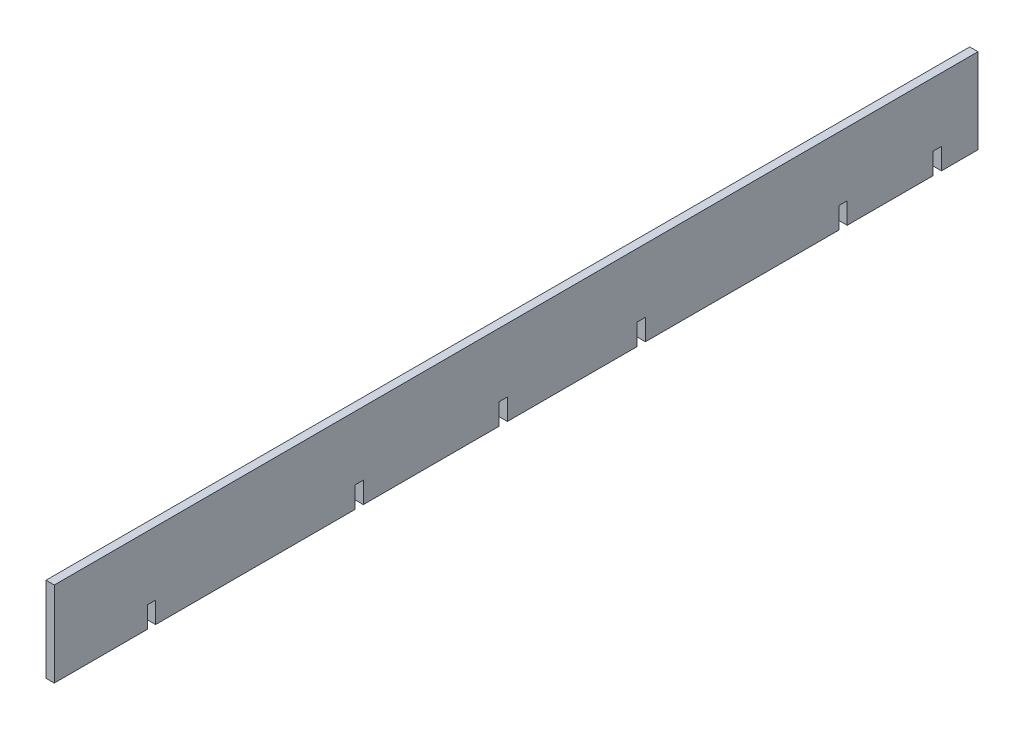
ISO-10303-21;
HEADER;
FILE_DESCRIPTION(('STEP AP214'),'2;1');
FILE_NAME('part.step','',(''),(''),'','','');
FILE_SCHEMA(('AUTOMOTIVE_DESIGN { 1 0 10303 214 1 1 1 1 }'));
ENDSEC;
DATA;
#1=APPLICATION_CONTEXT('core data for automotive mechanical design processes');
#2=APPLICATION_PROTOCOL_DEFINITION('international standard','automotive_design',2000,#1);
#3=PRODUCT_CONTEXT('',#1,'mechanical');
#4=PRODUCT('Part','Part','',(#3));
#5=PRODUCT_RELATED_PRODUCT_CATEGORY('part','',(#4));
#6=PRODUCT_DEFINITION_FORMATION('','',#4);
#7=PRODUCT_DEFINITION_CONTEXT('part definition',#1,'design');
#8=PRODUCT_DEFINITION('design','',#6,#7);
#9=PRODUCT_DEFINITION_SHAPE('','',#8);
#10=(LENGTH_UNIT() NAMED_UNIT(*) SI_UNIT(.MILLI.,.METRE.));
#11=(NAMED_UNIT(*) PLANE_ANGLE_UNIT() SI_UNIT($,.RADIAN.));
#12=(NAMED_UNIT(*) SI_UNIT($,.STERADIAN.) SOLID_ANGLE_UNIT());
#13=UNCERTAINTY_MEASURE_WITH_UNIT(LENGTH_MEASURE(1.E-05),#10,'distance_accuracy_value','');
#14=(GEOMETRIC_REPRESENTATION_CONTEXT(3) GLOBAL_UNCERTAINTY_ASSIGNED_CONTEXT((#13)) GLOBAL_UNIT_ASSIGNED_CONTEXT((#10,
#11,#12)) REPRESENTATION_CONTEXT('',''));
#15=CARTESIAN_POINT('',(0.,0.,0.));
#16=DIRECTION('',(0.,0.,1.));
#17=DIRECTION('',(1.,0.,0.));
#18=AXIS2_PLACEMENT_3D('',#15,#16,#17);
#19=CARTESIAN_POINT('',(154.684804484247,50.7999999999999,541.787102734886));
#20=DIRECTION('',(0.,0.,-1.));
#21=DIRECTION('',(-1.,0.,0.));
#22=AXIS2_PLACEMENT_3D('',#19,#20,#21);
#23=PLANE('',#22);
#24=DIRECTION('',(1.,0.,0.));
#25=VECTOR('',#24,1.);
#26=CARTESIAN_POINT('',(-125.857,50.7999999999999,541.787102734886));
#27=LINE('',#26,#25);
#28=CARTESIAN_POINT('',(-130.81,50.7999999999999,541.787102734886));
#29=VERTEX_POINT('',#28);
#30=CARTESIAN_POINT('',(-125.857,50.7999999999999,541.787102734886));
#31=VERTEX_POINT('',#30);
#32=EDGE_CURVE('E440',#29,#31,#27,.T.);
#33=ORIENTED_EDGE('',*,*,#32,.F.);
#34=DIRECTION('',(0.,-1.,0.));
#35=VECTOR('',#34,1.);
#36=CARTESIAN_POINT('',(-130.81,0.,541.787102734886));
#37=LINE('',#36,#35);
#38=CARTESIAN_POINT('',(-130.81,0.,541.787102734886));
#39=VERTEX_POINT('',#38);
#40=EDGE_CURVE('E11',#29,#39,#37,.T.);
#41=ORIENTED_EDGE('',*,*,#40,.T.);
#42=DIRECTION('',(1.,0.,0.));
#43=VECTOR('',#42,1.);
#44=CARTESIAN_POINT('',(-125.857,0.,541.787102734886));
#45=LINE('',#44,#43);
#46=CARTESIAN_POINT('',(-125.857,0.,541.787102734886));
#47=VERTEX_POINT('',#46);
#48=EDGE_CURVE('E41',#39,#47,#45,.T.);
#49=ORIENTED_EDGE('',*,*,#48,.T.);
#50=DIRECTION('',(0.,-1.,0.));
#51=VECTOR('',#50,1.);
#52=CARTESIAN_POINT('',(-125.857,0.,541.787102734886));
#53=LINE('',#52,#51);
#54=EDGE_CURVE('E36',#31,#47,#53,.T.);
#55=ORIENTED_EDGE('',*,*,#54,.F.);
#56=EDGE_LOOP('',(#33,#41,#49,#55));
#57=FACE_BOUND('',#56,.T.);
#58=ADVANCED_FACE('F33',(#57),#23,.F.);
#59=CARTESIAN_POINT('',(-125.857,0.,-10.548421882342));
#60=DIRECTION('',(0.,-1.,0.));
#61=DIRECTION('',(0.,0.,-1.));
#62=AXIS2_PLACEMENT_3D('',#59,#60,#61);
#63=PLANE('',#62);
#64=DIRECTION('',(0.,0.,1.));
#65=VECTOR('',#64,1.);
#66=CARTESIAN_POINT('',(-130.81,0.,-10.548421882342));
#67=LINE('',#66,#65);
#68=CARTESIAN_POINT('',(-130.81,0.,-10.548421882342));
#69=VERTEX_POINT('',#68);
#70=CARTESIAN_POINT('',(-130.81,0.,11.303));
#71=VERTEX_POINT('',#70);
#72=EDGE_CURVE('E318',#69,#71,#67,.T.);
#73=ORIENTED_EDGE('',*,*,#72,.F.);
#74=DIRECTION('',(-1.,0.,0.));
#75=VECTOR('',#74,1.);
#76=CARTESIAN_POINT('',(-125.857,0.,-10.548421882342));
#77=LINE('',#76,#75);
#78=CARTESIAN_POINT('',(-125.857,0.,-10.548421882342));
#79=VERTEX_POINT('',#78);
#80=EDGE_CURVE('E243',#79,#69,#77,.T.);
#81=ORIENTED_EDGE('',*,*,#80,.F.);
#82=DIRECTION('',(0.,0.,1.));
#83=VECTOR('',#82,1.);
#84=CARTESIAN_POINT('',(-125.857,0.,-10.548421882342));
#85=LINE('',#84,#83);
#86=CARTESIAN_POINT('',(-125.857,0.,11.303));
#87=VERTEX_POINT('',#86);
#88=EDGE_CURVE('E237',#79,#87,#85,.T.);
#89=ORIENTED_EDGE('',*,*,#88,.T.);
#90=DIRECTION('',(-1.,0.,0.));
#91=VECTOR('',#90,1.);
#92=CARTESIAN_POINT('',(-125.857,0.,11.303));
#93=LINE('',#92,#91);
#94=EDGE_CURVE('E219',#87,#71,#93,.T.);
#95=ORIENTED_EDGE('',*,*,#94,.T.);
#96=EDGE_LOOP('',(#73,#81,#89,#95));
#97=FACE_BOUND('',#96,.T.);
#98=ADVANCED_FACE('F242',(#97),#63,.T.);
#99=CARTESIAN_POINT('',(-125.857,0.,-10.548421882342));
#100=DIRECTION('',(0.,0.,1.));
#101=DIRECTION('',(1.,0.,0.));
#102=AXIS2_PLACEMENT_3D('',#99,#100,#101);
#103=PLANE('',#102);
#104=DIRECTION('',(0.,1.,0.));
#105=VECTOR('',#104,1.);
#106=CARTESIAN_POINT('',(-130.81,0.,-10.548421882342));
#107=LINE('',#106,#105);
#108=CARTESIAN_POINT('',(-130.81,50.8,-10.548421882342));
#109=VERTEX_POINT('',#108);
#110=EDGE_CURVE('E245',#69,#109,#107,.T.);
#111=ORIENTED_EDGE('',*,*,#110,.T.);
#112=DIRECTION('',(-1.,0.,0.));
#113=VECTOR('',#112,1.);
#114=CARTESIAN_POINT('',(-125.857,50.8,-10.548421882342));
#115=LINE('',#114,#113);
#116=CARTESIAN_POINT('',(-125.857,50.8,-10.548421882342));
#117=VERTEX_POINT('',#116);
#118=EDGE_CURVE('E392',#117,#109,#115,.T.);
#119=ORIENTED_EDGE('',*,*,#118,.F.);
#120=DIRECTION('',(0.,1.,0.));
#121=VECTOR('',#120,1.);
#122=CARTESIAN_POINT('',(-125.857,0.,-10.548421882342));
#123=LINE('',#122,#121);
#124=EDGE_CURVE('E230',#79,#117,#123,.T.);
#125=ORIENTED_EDGE('',*,*,#124,.F.);
#126=ORIENTED_EDGE('',*,*,#80,.T.);
#127=EDGE_LOOP('',(#111,#119,#125,#126));
#128=FACE_BOUND('',#127,.T.);
#129=ADVANCED_FACE('F538',(#128),#103,.F.);
#130=CARTESIAN_POINT('',(-125.857,50.8,-10.548421882342));
#131=DIRECTION('',(0.,-1.,0.));
#132=DIRECTION('',(0.,0.,-1.));
#133=AXIS2_PLACEMENT_3D('',#130,#131,#132);
#134=PLANE('',#133);
#135=DIRECTION('',(0.,0.,1.));
#136=VECTOR('',#135,1.);
#137=CARTESIAN_POINT('',(-130.81,50.8,-10.548421882342));
#138=LINE('',#137,#136);
#139=EDGE_CURVE('E247',#109,#29,#138,.T.);
#140=ORIENTED_EDGE('',*,*,#139,.T.);
#141=ORIENTED_EDGE('',*,*,#32,.T.);
#142=DIRECTION('',(0.,0.,1.));
#143=VECTOR('',#142,1.);
#144=CARTESIAN_POINT('',(-125.857,50.8,-10.548421882342));
#145=LINE('',#144,#143);
#146=EDGE_CURVE('E315',#117,#31,#145,.T.);
#147=ORIENTED_EDGE('',*,*,#146,.F.);
#148=ORIENTED_EDGE('',*,*,#118,.T.);
#149=EDGE_LOOP('',(#140,#141,#147,#148));
#150=FACE_BOUND('',#149,.T.);
#151=ADVANCED_FACE('F539',(#150),#134,.F.);
#152=CARTESIAN_POINT('',(-125.857,0.,486.156000000003));
#153=DIRECTION('',(0.,-1.,0.));
#154=DIRECTION('',(0.,0.,-1.));
#155=AXIS2_PLACEMENT_3D('',#152,#153,#154);
#156=PLANE('',#155);
#157=ORIENTED_EDGE('',*,*,#48,.F.);
#158=DIRECTION('',(0.,0.,1.));
#159=VECTOR('',#158,1.);
#160=CARTESIAN_POINT('',(-130.81,0.,486.156000000003));
#161=LINE('',#160,#159);
#162=CARTESIAN_POINT('',(-130.81,0.,486.156000000003));
#163=VERTEX_POINT('',#162);
#164=EDGE_CURVE('E387',#163,#39,#161,.T.);
#165=ORIENTED_EDGE('',*,*,#164,.F.);
#166=DIRECTION('',(-1.,0.,0.));
#167=VECTOR('',#166,1.);
#168=CARTESIAN_POINT('',(-125.857,0.,486.156000000003));
#169=LINE('',#168,#167);
#170=CARTESIAN_POINT('',(-125.857,0.,486.156000000003));
#171=VERTEX_POINT('',#170);
#172=EDGE_CURVE('E395',#171,#163,#169,.T.);
#173=ORIENTED_EDGE('',*,*,#172,.F.);
#174=DIRECTION('',(0.,0.,1.));
#175=VECTOR('',#174,1.);
#176=CARTESIAN_POINT('',(-125.857,0.,486.156000000003));
#177=LINE('',#176,#175);
#178=EDGE_CURVE('E313',#171,#47,#177,.T.);
#179=ORIENTED_EDGE('',*,*,#178,.T.);
#180=EDGE_LOOP('',(#157,#165,#173,#179));
#181=FACE_BOUND('',#180,.T.);
#182=ADVANCED_FACE('F447',(#181),#156,.T.);
#183=CARTESIAN_POINT('',(-125.857,12.6999999999999,486.156000000003));
#184=DIRECTION('',(0.,0.,-1.));
#185=DIRECTION('',(-1.,0.,0.));
#186=AXIS2_PLACEMENT_3D('',#183,#184,#185);
#187=PLANE('',#186);
#188=DIRECTION('',(0.,-1.,0.));
#189=VECTOR('',#188,1.);
#190=CARTESIAN_POINT('',(-130.81,12.6999999999999,486.156000000003));
#191=LINE('',#190,#189);
#192=CARTESIAN_POINT('',(-130.81,12.6999999999999,486.156000000003));
#193=VERTEX_POINT('',#192);
#194=EDGE_CURVE('E384',#193,#163,#191,.T.);
#195=ORIENTED_EDGE('',*,*,#194,.F.);
#196=DIRECTION('',(-1.,0.,0.));
#197=VECTOR('',#196,1.);
#198=CARTESIAN_POINT('',(-125.857,12.6999999999999,486.156000000003));
#199=LINE('',#198,#197);
#200=CARTESIAN_POINT('',(-125.857,12.6999999999999,486.156000000003));
#201=VERTEX_POINT('',#200);
#202=EDGE_CURVE('E397',#201,#193,#199,.T.);
#203=ORIENTED_EDGE('',*,*,#202,.F.);
#204=DIRECTION('',(0.,-1.,0.));
#205=VECTOR('',#204,1.);
#206=CARTESIAN_POINT('',(-125.857,12.6999999999999,486.156000000003));
#207=LINE('',#206,#205);
#208=EDGE_CURVE('E310',#201,#171,#207,.T.);
#209=ORIENTED_EDGE('',*,*,#208,.T.);
#210=ORIENTED_EDGE('',*,*,#172,.T.);
#211=EDGE_LOOP('',(#195,#203,#209,#210));
#212=FACE_BOUND('',#211,.T.);
#213=ADVANCED_FACE('F450',(#212),#187,.T.);
#214=CARTESIAN_POINT('',(-125.857,12.6999999999999,481.203000000003));
#215=DIRECTION('',(0.,-1.,0.));
#216=DIRECTION('',(0.,0.,-1.));
#217=AXIS2_PLACEMENT_3D('',#214,#215,#216);
#218=PLANE('',#217);
#219=DIRECTION('',(0.,0.,1.));
#220=VECTOR('',#219,1.);
#221=CARTESIAN_POINT('',(-130.81,12.6999999999999,481.203000000003));
#222=LINE('',#221,#220);
#223=CARTESIAN_POINT('',(-130.81,12.6999999999999,481.203000000003));
#224=VERTEX_POINT('',#223);
#225=EDGE_CURVE('E381',#224,#193,#222,.T.);
#226=ORIENTED_EDGE('',*,*,#225,.F.);
#227=DIRECTION('',(-1.,0.,0.));
#228=VECTOR('',#227,1.);
#229=CARTESIAN_POINT('',(-125.857,12.6999999999999,481.203000000003));
#230=LINE('',#229,#228);
#231=CARTESIAN_POINT('',(-125.857,12.6999999999999,481.203000000003));
#232=VERTEX_POINT('',#231);
#233=EDGE_CURVE('E399',#232,#224,#230,.T.);
#234=ORIENTED_EDGE('',*,*,#233,.F.);
#235=DIRECTION('',(0.,0.,1.));
#236=VECTOR('',#235,1.);
#237=CARTESIAN_POINT('',(-125.857,12.6999999999999,481.203000000003));
#238=LINE('',#237,#236);
#239=EDGE_CURVE('E307',#232,#201,#238,.T.);
#240=ORIENTED_EDGE('',*,*,#239,.T.);
#241=ORIENTED_EDGE('',*,*,#202,.T.);
#242=EDGE_LOOP('',(#226,#234,#240,#241));
#243=FACE_BOUND('',#242,.T.);
#244=ADVANCED_FACE('F455',(#243),#218,.T.);
#245=CARTESIAN_POINT('',(-125.857,0.,481.203000000003));
#246=DIRECTION('',(0.,0.,1.));
#247=DIRECTION('',(1.,0.,0.));
#248=AXIS2_PLACEMENT_3D('',#245,#246,#247);
#249=PLANE('',#248);
#250=DIRECTION('',(0.,1.,0.));
#251=VECTOR('',#250,1.);
#252=CARTESIAN_POINT('',(-130.81,0.,481.203000000003));
#253=LINE('',#252,#251);
#254=CARTESIAN_POINT('',(-130.81,0.,481.203000000003));
#255=VERTEX_POINT('',#254);
#256=EDGE_CURVE('E378',#255,#224,#253,.T.);
#257=ORIENTED_EDGE('',*,*,#256,.F.);
#258=DIRECTION('',(-1.,0.,0.));
#259=VECTOR('',#258,1.);
#260=CARTESIAN_POINT('',(-125.857,0.,481.203000000003));
#261=LINE('',#260,#259);
#262=CARTESIAN_POINT('',(-125.857,0.,481.203000000003));
#263=VERTEX_POINT('',#262);
#264=EDGE_CURVE('E401',#263,#255,#261,.T.);
#265=ORIENTED_EDGE('',*,*,#264,.F.);
#266=DIRECTION('',(0.,1.,0.));
#267=VECTOR('',#266,1.);
#268=CARTESIAN_POINT('',(-125.857,0.,481.203000000003));
#269=LINE('',#268,#267);
#270=EDGE_CURVE('E304',#263,#232,#269,.T.);
#271=ORIENTED_EDGE('',*,*,#270,.T.);
#272=ORIENTED_EDGE('',*,*,#233,.T.);
#273=EDGE_LOOP('',(#257,#265,#271,#272));
#274=FACE_BOUND('',#273,.T.);
#275=ADVANCED_FACE('F458',(#274),#249,.T.);
#276=CARTESIAN_POINT('',(-125.857,0.,361.950000000003));
#277=DIRECTION('',(0.,-1.,0.));
#278=DIRECTION('',(0.,0.,-1.));
#279=AXIS2_PLACEMENT_3D('',#276,#277,#278);
#280=PLANE('',#279);
#281=DIRECTION('',(0.,0.,1.));
#282=VECTOR('',#281,1.);
#283=CARTESIAN_POINT('',(-130.81,0.,361.950000000003));
#284=LINE('',#283,#282);
#285=CARTESIAN_POINT('',(-130.81,0.,361.950000000003));
#286=VERTEX_POINT('',#285);
#287=EDGE_CURVE('E375',#286,#255,#284,.T.);
#288=ORIENTED_EDGE('',*,*,#287,.F.);
#289=DIRECTION('',(-1.,0.,0.));
#290=VECTOR('',#289,1.);
#291=CARTESIAN_POINT('',(-125.857,0.,361.950000000003));
#292=LINE('',#291,#290);
#293=CARTESIAN_POINT('',(-125.857,0.,361.950000000003));
#294=VERTEX_POINT('',#293);
#295=EDGE_CURVE('E403',#294,#286,#292,.T.);
#296=ORIENTED_EDGE('',*,*,#295,.F.);
#297=DIRECTION('',(0.,0.,1.));
#298=VECTOR('',#297,1.);
#299=CARTESIAN_POINT('',(-125.857,0.,361.950000000003));
#300=LINE('',#299,#298);
#301=EDGE_CURVE('E301',#294,#263,#300,.T.);
#302=ORIENTED_EDGE('',*,*,#301,.T.);
#303=ORIENTED_EDGE('',*,*,#264,.T.);
#304=EDGE_LOOP('',(#288,#296,#302,#303));
#305=FACE_BOUND('',#304,.T.);
#306=ADVANCED_FACE('F463',(#305),#280,.T.);
#307=CARTESIAN_POINT('',(-125.857,12.6999999999999,361.950000000003));
#308=DIRECTION('',(0.,0.,-1.));
#309=DIRECTION('',(-1.,0.,0.));
#310=AXIS2_PLACEMENT_3D('',#307,#308,#309);
#311=PLANE('',#310);
#312=DIRECTION('',(0.,-1.,0.));
#313=VECTOR('',#312,1.);
#314=CARTESIAN_POINT('',(-130.81,12.6999999999999,361.950000000003));
#315=LINE('',#314,#313);
#316=CARTESIAN_POINT('',(-130.81,12.6999999999999,361.950000000003));
#317=VERTEX_POINT('',#316);
#318=EDGE_CURVE('E372',#317,#286,#315,.T.);
#319=ORIENTED_EDGE('',*,*,#318,.F.);
#320=DIRECTION('',(-1.,0.,0.));
#321=VECTOR('',#320,1.);
#322=CARTESIAN_POINT('',(-125.857,12.6999999999999,361.950000000003));
#323=LINE('',#322,#321);
#324=CARTESIAN_POINT('',(-125.857,12.6999999999999,361.950000000003));
#325=VERTEX_POINT('',#324);
#326=EDGE_CURVE('E405',#325,#317,#323,.T.);
#327=ORIENTED_EDGE('',*,*,#326,.F.);
#328=DIRECTION('',(0.,-1.,0.));
#329=VECTOR('',#328,1.);
#330=CARTESIAN_POINT('',(-125.857,12.6999999999999,361.950000000003));
#331=LINE('',#330,#329);
#332=EDGE_CURVE('E298',#325,#294,#331,.T.);
#333=ORIENTED_EDGE('',*,*,#332,.T.);
#334=ORIENTED_EDGE('',*,*,#295,.T.);
#335=EDGE_LOOP('',(#319,#327,#333,#334));
#336=FACE_BOUND('',#335,.T.);
#337=ADVANCED_FACE('F466',(#336),#311,.T.);
#338=CARTESIAN_POINT('',(-125.857,12.6999999999999,356.997000000003));
#339=DIRECTION('',(0.,-1.,0.));
#340=DIRECTION('',(0.,0.,-1.));
#341=AXIS2_PLACEMENT_3D('',#338,#339,#340);
#342=PLANE('',#341);
#343=DIRECTION('',(0.,0.,1.));
#344=VECTOR('',#343,1.);
#345=CARTESIAN_POINT('',(-130.81,12.6999999999999,356.997000000003));
#346=LINE('',#345,#344);
#347=CARTESIAN_POINT('',(-130.81,12.6999999999999,356.997000000003));
#348=VERTEX_POINT('',#347);
#349=EDGE_CURVE('E369',#348,#317,#346,.T.);
#350=ORIENTED_EDGE('',*,*,#349,.F.);
#351=DIRECTION('',(-1.,0.,0.));
#352=VECTOR('',#351,1.);
#353=CARTESIAN_POINT('',(-125.857,12.6999999999999,356.997000000003));
#354=LINE('',#353,#352);
#355=CARTESIAN_POINT('',(-125.857,12.6999999999999,356.997000000003));
#356=VERTEX_POINT('',#355);
#357=EDGE_CURVE('E407',#356,#348,#354,.T.);
#358=ORIENTED_EDGE('',*,*,#357,.F.);
#359=DIRECTION('',(0.,0.,1.));
#360=VECTOR('',#359,1.);
#361=CARTESIAN_POINT('',(-125.857,12.6999999999999,356.997000000003));
#362=LINE('',#361,#360);
#363=EDGE_CURVE('E295',#356,#325,#362,.T.);
#364=ORIENTED_EDGE('',*,*,#363,.T.);
#365=ORIENTED_EDGE('',*,*,#326,.T.);
#366=EDGE_LOOP('',(#350,#358,#364,#365));
#367=FACE_BOUND('',#366,.T.);
#368=ADVANCED_FACE('F471',(#367),#342,.T.);
#369=CARTESIAN_POINT('',(-125.857,0.,356.997000000003));
#370=DIRECTION('',(0.,0.,1.));
#371=DIRECTION('',(1.,0.,0.));
#372=AXIS2_PLACEMENT_3D('',#369,#370,#371);
#373=PLANE('',#372);
#374=DIRECTION('',(0.,1.,0.));
#375=VECTOR('',#374,1.);
#376=CARTESIAN_POINT('',(-130.81,0.,356.997000000003));
#377=LINE('',#376,#375);
#378=CARTESIAN_POINT('',(-130.81,0.,356.997000000003));
#379=VERTEX_POINT('',#378);
#380=EDGE_CURVE('E366',#379,#348,#377,.T.);
#381=ORIENTED_EDGE('',*,*,#380,.F.);
#382=DIRECTION('',(-1.,0.,0.));
#383=VECTOR('',#382,1.);
#384=CARTESIAN_POINT('',(-125.857,0.,356.997000000003));
#385=LINE('',#384,#383);
#386=CARTESIAN_POINT('',(-125.857,0.,356.997000000003));
#387=VERTEX_POINT('',#386);
#388=EDGE_CURVE('E409',#387,#379,#385,.T.);
#389=ORIENTED_EDGE('',*,*,#388,.F.);
#390=DIRECTION('',(0.,1.,0.));
#391=VECTOR('',#390,1.);
#392=CARTESIAN_POINT('',(-125.857,0.,356.997000000003));
#393=LINE('',#392,#391);
#394=EDGE_CURVE('E292',#387,#356,#393,.T.);
#395=ORIENTED_EDGE('',*,*,#394,.T.);
#396=ORIENTED_EDGE('',*,*,#357,.T.);
#397=EDGE_LOOP('',(#381,#389,#395,#396));
#398=FACE_BOUND('',#397,.T.);
#399=ADVANCED_FACE('F474',(#398),#373,.T.);
#400=CARTESIAN_POINT('',(-125.857,0.,275.818959410004));
#401=DIRECTION('',(0.,-1.,0.));
#402=DIRECTION('',(0.,0.,-1.));
#403=AXIS2_PLACEMENT_3D('',#400,#401,#402);
#404=PLANE('',#403);
#405=DIRECTION('',(0.,0.,1.));
#406=VECTOR('',#405,1.);
#407=CARTESIAN_POINT('',(-130.81,0.,275.818959410004));
#408=LINE('',#407,#406);
#409=CARTESIAN_POINT('',(-130.81,0.,275.818959410004));
#410=VERTEX_POINT('',#409);
#411=EDGE_CURVE('E363',#410,#379,#408,.T.);
#412=ORIENTED_EDGE('',*,*,#411,.F.);
#413=DIRECTION('',(-1.,0.,0.));
#414=VECTOR('',#413,1.);
#415=CARTESIAN_POINT('',(-125.857,0.,275.818959410004));
#416=LINE('',#415,#414);
#417=CARTESIAN_POINT('',(-125.857,0.,275.818959410004));
#418=VERTEX_POINT('',#417);
#419=EDGE_CURVE('E411',#418,#410,#416,.T.);
#420=ORIENTED_EDGE('',*,*,#419,.F.);
#421=DIRECTION('',(0.,0.,1.));
#422=VECTOR('',#421,1.);
#423=CARTESIAN_POINT('',(-125.857,0.,275.818959410004));
#424=LINE('',#423,#422);
#425=EDGE_CURVE('E289',#418,#387,#424,.T.);
#426=ORIENTED_EDGE('',*,*,#425,.T.);
#427=ORIENTED_EDGE('',*,*,#388,.T.);
#428=EDGE_LOOP('',(#412,#420,#426,#427));
#429=FACE_BOUND('',#428,.T.);
#430=ADVANCED_FACE('F479',(#429),#404,.T.);
#431=CARTESIAN_POINT('',(-125.857,12.7,275.818959410004));
#432=DIRECTION('',(0.,0.,-1.));
#433=DIRECTION('',(-1.,0.,0.));
#434=AXIS2_PLACEMENT_3D('',#431,#432,#433);
#435=PLANE('',#434);
#436=DIRECTION('',(0.,-1.,0.));
#437=VECTOR('',#436,1.);
#438=CARTESIAN_POINT('',(-130.81,12.7,275.818959410004));
#439=LINE('',#438,#437);
#440=CARTESIAN_POINT('',(-130.81,12.7,275.818959410004));
#441=VERTEX_POINT('',#440);
#442=EDGE_CURVE('E360',#441,#410,#439,.T.);
#443=ORIENTED_EDGE('',*,*,#442,.F.);
#444=DIRECTION('',(-1.,0.,0.));
#445=VECTOR('',#444,1.);
#446=CARTESIAN_POINT('',(-125.857,12.7,275.818959410004));
#447=LINE('',#446,#445);
#448=CARTESIAN_POINT('',(-125.857,12.7,275.818959410004));
#449=VERTEX_POINT('',#448);
#450=EDGE_CURVE('E413',#449,#441,#447,.T.);
#451=ORIENTED_EDGE('',*,*,#450,.F.);
#452=DIRECTION('',(0.,-1.,0.));
#453=VECTOR('',#452,1.);
#454=CARTESIAN_POINT('',(-125.857,12.7,275.818959410004));
#455=LINE('',#454,#453);
#456=EDGE_CURVE('E286',#449,#418,#455,.T.);
#457=ORIENTED_EDGE('',*,*,#456,.T.);
#458=ORIENTED_EDGE('',*,*,#419,.T.);
#459=EDGE_LOOP('',(#443,#451,#457,#458));
#460=FACE_BOUND('',#459,.T.);
#461=ADVANCED_FACE('F482',(#460),#435,.T.);
#462=CARTESIAN_POINT('',(-125.857,12.7,270.865959410004));
#463=DIRECTION('',(0.,-1.,0.));
#464=DIRECTION('',(0.,0.,-1.));
#465=AXIS2_PLACEMENT_3D('',#462,#463,#464);
#466=PLANE('',#465);
#467=DIRECTION('',(0.,0.,1.));
#468=VECTOR('',#467,1.);
#469=CARTESIAN_POINT('',(-130.81,12.7,270.865959410004));
#470=LINE('',#469,#468);
#471=CARTESIAN_POINT('',(-130.81,12.7,270.865959410004));
#472=VERTEX_POINT('',#471);
#473=EDGE_CURVE('E357',#472,#441,#470,.T.);
#474=ORIENTED_EDGE('',*,*,#473,.F.);
#475=DIRECTION('',(-1.,0.,0.));
#476=VECTOR('',#475,1.);
#477=CARTESIAN_POINT('',(-125.857,12.7,270.865959410004));
#478=LINE('',#477,#476);
#479=CARTESIAN_POINT('',(-125.857,12.7,270.865959410004));
#480=VERTEX_POINT('',#479);
#481=EDGE_CURVE('E415',#480,#472,#478,.T.);
#482=ORIENTED_EDGE('',*,*,#481,.F.);
#483=DIRECTION('',(0.,0.,1.));
#484=VECTOR('',#483,1.);
#485=CARTESIAN_POINT('',(-125.857,12.7,270.865959410004));
#486=LINE('',#485,#484);
#487=EDGE_CURVE('E283',#480,#449,#486,.T.);
#488=ORIENTED_EDGE('',*,*,#487,.T.);
#489=ORIENTED_EDGE('',*,*,#450,.T.);
#490=EDGE_LOOP('',(#474,#482,#488,#489));
#491=FACE_BOUND('',#490,.T.);
#492=ADVANCED_FACE('F487',(#491),#466,.T.);
#493=CARTESIAN_POINT('',(-125.857,0.,270.865959410004));
#494=DIRECTION('',(0.,0.,1.));
#495=DIRECTION('',(1.,0.,0.));
#496=AXIS2_PLACEMENT_3D('',#493,#494,#495);
#497=PLANE('',#496);
#498=DIRECTION('',(0.,1.,0.));
#499=VECTOR('',#498,1.);
#500=CARTESIAN_POINT('',(-130.81,0.,270.865959410004));
#501=LINE('',#500,#499);
#502=CARTESIAN_POINT('',(-130.81,0.,270.865959410004));
#503=VERTEX_POINT('',#502);
#504=EDGE_CURVE('E354',#503,#472,#501,.T.);
#505=ORIENTED_EDGE('',*,*,#504,.F.);
#506=DIRECTION('',(-1.,0.,0.));
#507=VECTOR('',#506,1.);
#508=CARTESIAN_POINT('',(-125.857,0.,270.865959410004));
#509=LINE('',#508,#507);
#510=CARTESIAN_POINT('',(-125.857,0.,270.865959410004));
#511=VERTEX_POINT('',#510);
#512=EDGE_CURVE('E417',#511,#503,#509,.T.);
#513=ORIENTED_EDGE('',*,*,#512,.F.);
#514=DIRECTION('',(0.,1.,0.));
#515=VECTOR('',#514,1.);
#516=CARTESIAN_POINT('',(-125.857,0.,270.865959410004));
#517=LINE('',#516,#515);
#518=EDGE_CURVE('E280',#511,#480,#517,.T.);
#519=ORIENTED_EDGE('',*,*,#518,.T.);
#520=ORIENTED_EDGE('',*,*,#481,.T.);
#521=EDGE_LOOP('',(#505,#513,#519,#520));
#522=FACE_BOUND('',#521,.T.);
#523=ADVANCED_FACE('F490',(#522),#497,.T.);
#524=CARTESIAN_POINT('',(-125.857,-1.66289080048642E-09,193.26888197481));
#525=DIRECTION('',(0.,-1.,2.14289975281403E-11));
#526=DIRECTION('',(0.,-2.14289975281403E-11,-1.));
#527=AXIS2_PLACEMENT_3D('',#524,#525,#526);
#528=PLANE('',#527);
#529=DIRECTION('',(0.,2.14289975281403E-11,1.));
#530=VECTOR('',#529,1.);
#531=CARTESIAN_POINT('',(-130.81,-1.66289080048642E-09,193.26888197481));
#532=LINE('',#531,#530);
#533=CARTESIAN_POINT('',(-130.81,-1.66289080048642E-09,193.26888197481));
#534=VERTEX_POINT('',#533);
#535=EDGE_CURVE('E351',#534,#503,#532,.T.);
#536=ORIENTED_EDGE('',*,*,#535,.F.);
#537=DIRECTION('',(-1.,0.,0.));
#538=VECTOR('',#537,1.);
#539=CARTESIAN_POINT('',(-125.857,-1.66289080048642E-09,193.26888197481));
#540=LINE('',#539,#538);
#541=CARTESIAN_POINT('',(-125.857,-1.66289080048642E-09,193.26888197481));
#542=VERTEX_POINT('',#541);
#543=EDGE_CURVE('E419',#542,#534,#540,.T.);
#544=ORIENTED_EDGE('',*,*,#543,.F.);
#545=DIRECTION('',(0.,2.14289975281403E-11,1.));
#546=VECTOR('',#545,1.);
#547=CARTESIAN_POINT('',(-125.857,-1.66289080048642E-09,193.26888197481));
#548=LINE('',#547,#546);
#549=EDGE_CURVE('E277',#542,#511,#548,.T.);
#550=ORIENTED_EDGE('',*,*,#549,.T.);
#551=ORIENTED_EDGE('',*,*,#512,.T.);
#552=EDGE_LOOP('',(#536,#544,#550,#551));
#553=FACE_BOUND('',#552,.T.);
#554=ADVANCED_FACE('F495',(#553),#528,.T.);
#555=CARTESIAN_POINT('',(-125.857,12.7,193.26888197481));
#556=DIRECTION('',(0.,0.,-1.));
#557=DIRECTION('',(-1.,0.,0.));
#558=AXIS2_PLACEMENT_3D('',#555,#556,#557);
#559=PLANE('',#558);
#560=DIRECTION('',(0.,-1.,0.));
#561=VECTOR('',#560,1.);
#562=CARTESIAN_POINT('',(-130.81,12.7,193.26888197481));
#563=LINE('',#562,#561);
#564=CARTESIAN_POINT('',(-130.81,12.7,193.26888197481));
#565=VERTEX_POINT('',#564);
#566=EDGE_CURVE('E348',#565,#534,#563,.T.);
#567=ORIENTED_EDGE('',*,*,#566,.F.);
#568=DIRECTION('',(-1.,0.,0.));
#569=VECTOR('',#568,1.);
#570=CARTESIAN_POINT('',(-125.857,12.7,193.26888197481));
#571=LINE('',#570,#569);
#572=CARTESIAN_POINT('',(-125.857,12.7,193.26888197481));
#573=VERTEX_POINT('',#572);
#574=EDGE_CURVE('E421',#573,#565,#571,.T.);
#575=ORIENTED_EDGE('',*,*,#574,.F.);
#576=DIRECTION('',(0.,-1.,0.));
#577=VECTOR('',#576,1.);
#578=CARTESIAN_POINT('',(-125.857,12.7,193.26888197481));
#579=LINE('',#578,#577);
#580=EDGE_CURVE('E274',#573,#542,#579,.T.);
#581=ORIENTED_EDGE('',*,*,#580,.T.);
#582=ORIENTED_EDGE('',*,*,#543,.T.);
#583=EDGE_LOOP('',(#567,#575,#581,#582));
#584=FACE_BOUND('',#583,.T.);
#585=ADVANCED_FACE('F498',(#584),#559,.T.);
#586=CARTESIAN_POINT('',(-125.857,12.7,188.315883718));
#587=DIRECTION('',(0.,-1.,0.));
#588=DIRECTION('',(0.,0.,-1.));
#589=AXIS2_PLACEMENT_3D('',#586,#587,#588);
#590=PLANE('',#589);
#591=DIRECTION('',(0.,0.,1.));
#592=VECTOR('',#591,1.);
#593=CARTESIAN_POINT('',(-130.81,12.7,188.315883718));
#594=LINE('',#593,#592);
#595=CARTESIAN_POINT('',(-130.81,12.7,188.315883718));
#596=VERTEX_POINT('',#595);
#597=EDGE_CURVE('E345',#596,#565,#594,.T.);
#598=ORIENTED_EDGE('',*,*,#597,.F.);
#599=DIRECTION('',(-1.,0.,0.));
#600=VECTOR('',#599,1.);
#601=CARTESIAN_POINT('',(-125.857,12.7,188.315883718));
#602=LINE('',#601,#600);
#603=CARTESIAN_POINT('',(-125.857,12.7,188.315883718));
#604=VERTEX_POINT('',#603);
#605=EDGE_CURVE('E423',#604,#596,#602,.T.);
#606=ORIENTED_EDGE('',*,*,#605,.F.);
#607=DIRECTION('',(0.,0.,1.));
#608=VECTOR('',#607,1.);
#609=CARTESIAN_POINT('',(-125.857,12.7,188.315883718));
#610=LINE('',#609,#608);
#611=EDGE_CURVE('E271',#604,#573,#610,.T.);
#612=ORIENTED_EDGE('',*,*,#611,.T.);
#613=ORIENTED_EDGE('',*,*,#574,.T.);
#614=EDGE_LOOP('',(#598,#606,#612,#613));
#615=FACE_BOUND('',#614,.T.);
#616=ADVANCED_FACE('F503',(#615),#590,.T.);
#617=CARTESIAN_POINT('',(-125.857,0.,188.315883718));
#618=DIRECTION('',(0.,0.,1.));
#619=DIRECTION('',(1.,0.,0.));
#620=AXIS2_PLACEMENT_3D('',#617,#618,#619);
#621=PLANE('',#620);
#622=DIRECTION('',(0.,1.,0.));
#623=VECTOR('',#622,1.);
#624=CARTESIAN_POINT('',(-130.81,0.,188.315883718));
#625=LINE('',#624,#623);
#626=CARTESIAN_POINT('',(-130.81,0.,188.315883718));
#627=VERTEX_POINT('',#626);
#628=EDGE_CURVE('E342',#627,#596,#625,.T.);
#629=ORIENTED_EDGE('',*,*,#628,.F.);
#630=DIRECTION('',(-1.,0.,0.));
#631=VECTOR('',#630,1.);
#632=CARTESIAN_POINT('',(-125.857,0.,188.315883718));
#633=LINE('',#632,#631);
#634=CARTESIAN_POINT('',(-125.857,0.,188.315883718));
#635=VERTEX_POINT('',#634);
#636=EDGE_CURVE('E425',#635,#627,#633,.T.);
#637=ORIENTED_EDGE('',*,*,#636,.F.);
#638=DIRECTION('',(0.,1.,0.));
#639=VECTOR('',#638,1.);
#640=CARTESIAN_POINT('',(-125.857,0.,188.315883718));
#641=LINE('',#640,#639);
#642=EDGE_CURVE('E268',#635,#604,#641,.T.);
#643=ORIENTED_EDGE('',*,*,#642,.T.);
#644=ORIENTED_EDGE('',*,*,#605,.T.);
#645=EDGE_LOOP('',(#629,#637,#643,#644));
#646=FACE_BOUND('',#645,.T.);
#647=ADVANCED_FACE('F506',(#646),#621,.T.);
#648=CARTESIAN_POINT('',(-125.857,1.06304987649857E-13,72.6189594100002));
#649=DIRECTION('',(0.,-1.,0.));
#650=DIRECTION('',(0.,0.,-1.));
#651=AXIS2_PLACEMENT_3D('',#648,#649,#650);
#652=PLANE('',#651);
#653=DIRECTION('',(0.,0.,1.));
#654=VECTOR('',#653,1.);
#655=CARTESIAN_POINT('',(-130.81,1.06304987649857E-13,72.6189594100002));
#656=LINE('',#655,#654);
#657=CARTESIAN_POINT('',(-130.81,1.06304987649857E-13,72.6189594100002));
#658=VERTEX_POINT('',#657);
#659=EDGE_CURVE('E339',#658,#627,#656,.T.);
#660=ORIENTED_EDGE('',*,*,#659,.F.);
#661=DIRECTION('',(-1.,0.,0.));
#662=VECTOR('',#661,1.);
#663=CARTESIAN_POINT('',(-125.857,1.06304987649857E-13,72.6189594100002));
#664=LINE('',#663,#662);
#665=CARTESIAN_POINT('',(-125.857,1.06304987649857E-13,72.6189594100002));
#666=VERTEX_POINT('',#665);
#667=EDGE_CURVE('E427',#666,#658,#664,.T.);
#668=ORIENTED_EDGE('',*,*,#667,.F.);
#669=DIRECTION('',(0.,0.,1.));
#670=VECTOR('',#669,1.);
#671=CARTESIAN_POINT('',(-125.857,1.06304987649857E-13,72.6189594100002));
#672=LINE('',#671,#670);
#673=EDGE_CURVE('E265',#666,#635,#672,.T.);
#674=ORIENTED_EDGE('',*,*,#673,.T.);
#675=ORIENTED_EDGE('',*,*,#636,.T.);
#676=EDGE_LOOP('',(#660,#668,#674,#675));
#677=FACE_BOUND('',#676,.T.);
#678=ADVANCED_FACE('F511',(#677),#652,.T.);
#679=CARTESIAN_POINT('',(-125.857,12.7,72.6189594100002));
#680=DIRECTION('',(0.,0.,-1.));
#681=DIRECTION('',(-1.,0.,0.));
#682=AXIS2_PLACEMENT_3D('',#679,#680,#681);
#683=PLANE('',#682);
#684=DIRECTION('',(0.,-1.,0.));
#685=VECTOR('',#684,1.);
#686=CARTESIAN_POINT('',(-130.81,12.7,72.6189594100002));
#687=LINE('',#686,#685);
#688=CARTESIAN_POINT('',(-130.81,12.7,72.6189594100002));
#689=VERTEX_POINT('',#688);
#690=EDGE_CURVE('E336',#689,#658,#687,.T.);
#691=ORIENTED_EDGE('',*,*,#690,.F.);
#692=DIRECTION('',(-1.,0.,0.));
#693=VECTOR('',#692,1.);
#694=CARTESIAN_POINT('',(-125.857,12.7,72.6189594100002));
#695=LINE('',#694,#693);
#696=CARTESIAN_POINT('',(-125.857,12.7,72.6189594100002));
#697=VERTEX_POINT('',#696);
#698=EDGE_CURVE('E429',#697,#689,#695,.T.);
#699=ORIENTED_EDGE('',*,*,#698,.F.);
#700=DIRECTION('',(0.,-1.,0.));
#701=VECTOR('',#700,1.);
#702=CARTESIAN_POINT('',(-125.857,12.7,72.6189594100002));
#703=LINE('',#702,#701);
#704=EDGE_CURVE('E262',#697,#666,#703,.T.);
#705=ORIENTED_EDGE('',*,*,#704,.T.);
#706=ORIENTED_EDGE('',*,*,#667,.T.);
#707=EDGE_LOOP('',(#691,#699,#705,#706));
#708=FACE_BOUND('',#707,.T.);
#709=ADVANCED_FACE('F514',(#708),#683,.T.);
#710=CARTESIAN_POINT('',(-125.857,12.7,72.6189594100002));
#711=DIRECTION('',(0.,1.,0.));
#712=DIRECTION('',(0.,0.,1.));
#713=AXIS2_PLACEMENT_3D('',#710,#711,#712);
#714=PLANE('',#713);
#715=DIRECTION('',(0.,0.,-1.));
#716=VECTOR('',#715,1.);
#717=CARTESIAN_POINT('',(-130.81,12.7,72.6189594100002));
#718=LINE('',#717,#716);
#719=CARTESIAN_POINT('',(-130.81,12.7,67.6659590678931));
#720=VERTEX_POINT('',#719);
#721=EDGE_CURVE('E333',#689,#720,#718,.T.);
#722=ORIENTED_EDGE('',*,*,#721,.T.);
#723=DIRECTION('',(-1.,0.,0.));
#724=VECTOR('',#723,1.);
#725=CARTESIAN_POINT('',(-125.857,12.7,67.6659590678931));
#726=LINE('',#725,#724);
#727=CARTESIAN_POINT('',(-125.857,12.7,67.6659590678931));
#728=VERTEX_POINT('',#727);
#729=EDGE_CURVE('E431',#728,#720,#726,.T.);
#730=ORIENTED_EDGE('',*,*,#729,.F.);
#731=DIRECTION('',(0.,0.,-1.));
#732=VECTOR('',#731,1.);
#733=CARTESIAN_POINT('',(-125.857,12.7,72.6189594100002));
#734=LINE('',#733,#732);
#735=EDGE_CURVE('E260',#697,#728,#734,.T.);
#736=ORIENTED_EDGE('',*,*,#735,.F.);
#737=ORIENTED_EDGE('',*,*,#698,.T.);
#738=EDGE_LOOP('',(#722,#730,#736,#737));
#739=FACE_BOUND('',#738,.T.);
#740=ADVANCED_FACE('F520',(#739),#714,.F.);
#741=CARTESIAN_POINT('',(-125.857,-1.36955362366613E-10,67.6659590678931));
#742=DIRECTION('',(0.,0.,1.));
#743=DIRECTION('',(1.,0.,0.));
#744=AXIS2_PLACEMENT_3D('',#741,#742,#743);
#745=PLANE('',#744);
#746=DIRECTION('',(0.,1.,0.));
#747=VECTOR('',#746,1.);
#748=CARTESIAN_POINT('',(-130.81,-1.36955362366613E-10,67.6659590678931));
#749=LINE('',#748,#747);
#750=CARTESIAN_POINT('',(-130.81,-1.36955362366613E-10,67.6659590678931));
#751=VERTEX_POINT('',#750);
#752=EDGE_CURVE('E330',#751,#720,#749,.T.);
#753=ORIENTED_EDGE('',*,*,#752,.F.);
#754=DIRECTION('',(-1.,0.,0.));
#755=VECTOR('',#754,1.);
#756=CARTESIAN_POINT('',(-125.857,-1.36955362366613E-10,67.6659590678931));
#757=LINE('',#756,#755);
#758=CARTESIAN_POINT('',(-125.857,-1.36955362366613E-10,67.6659590678931));
#759=VERTEX_POINT('',#758);
#760=EDGE_CURVE('E433',#759,#751,#757,.T.);
#761=ORIENTED_EDGE('',*,*,#760,.F.);
#762=DIRECTION('',(0.,1.,0.));
#763=VECTOR('',#762,1.);
#764=CARTESIAN_POINT('',(-125.857,-1.36955362366613E-10,67.6659590678931));
#765=LINE('',#764,#763);
#766=EDGE_CURVE('E257',#759,#728,#765,.T.);
#767=ORIENTED_EDGE('',*,*,#766,.T.);
#768=ORIENTED_EDGE('',*,*,#729,.T.);
#769=EDGE_LOOP('',(#753,#761,#767,#768));
#770=FACE_BOUND('',#769,.T.);
#771=ADVANCED_FACE('F524',(#770),#745,.T.);
#772=CARTESIAN_POINT('',(-125.857,0.,16.256));
#773=DIRECTION('',(0.,-1.,-2.66334959201755E-12));
#774=DIRECTION('',(0.,2.66334959201755E-12,-1.));
#775=AXIS2_PLACEMENT_3D('',#772,#773,#774);
#776=PLANE('',#775);
#777=DIRECTION('',(0.,-2.66334959201755E-12,1.));
#778=VECTOR('',#777,1.);
#779=CARTESIAN_POINT('',(-130.81,0.,16.256));
#780=LINE('',#779,#778);
#781=CARTESIAN_POINT('',(-130.81,0.,16.256));
#782=VERTEX_POINT('',#781);
#783=EDGE_CURVE('E327',#782,#751,#780,.T.);
#784=ORIENTED_EDGE('',*,*,#783,.F.);
#785=DIRECTION('',(-1.,0.,0.));
#786=VECTOR('',#785,1.);
#787=CARTESIAN_POINT('',(-125.857,0.,16.256));
#788=LINE('',#787,#786);
#789=CARTESIAN_POINT('',(-125.857,0.,16.256));
#790=VERTEX_POINT('',#789);
#791=EDGE_CURVE('E435',#790,#782,#788,.T.);
#792=ORIENTED_EDGE('',*,*,#791,.F.);
#793=DIRECTION('',(0.,-2.66334959201755E-12,1.));
#794=VECTOR('',#793,1.);
#795=CARTESIAN_POINT('',(-125.857,0.,16.256));
#796=LINE('',#795,#794);
#797=EDGE_CURVE('E254',#790,#759,#796,.T.);
#798=ORIENTED_EDGE('',*,*,#797,.T.);
#799=ORIENTED_EDGE('',*,*,#760,.T.);
#800=EDGE_LOOP('',(#784,#792,#798,#799));
#801=FACE_BOUND('',#800,.T.);
#802=ADVANCED_FACE('F527',(#801),#776,.T.);
#803=CARTESIAN_POINT('',(-125.857,12.7,16.256));
#804=DIRECTION('',(0.,0.,-1.));
#805=DIRECTION('',(-1.,0.,0.));
#806=AXIS2_PLACEMENT_3D('',#803,#804,#805);
#807=PLANE('',#806);
#808=DIRECTION('',(0.,-1.,0.));
#809=VECTOR('',#808,1.);
#810=CARTESIAN_POINT('',(-130.81,12.7,16.256));
#811=LINE('',#810,#809);
#812=CARTESIAN_POINT('',(-130.81,12.7,16.256));
#813=VERTEX_POINT('',#812);
#814=EDGE_CURVE('E324',#813,#782,#811,.T.);
#815=ORIENTED_EDGE('',*,*,#814,.F.);
#816=DIRECTION('',(-1.,0.,0.));
#817=VECTOR('',#816,1.);
#818=CARTESIAN_POINT('',(-125.857,12.7,16.256));
#819=LINE('',#818,#817);
#820=CARTESIAN_POINT('',(-125.857,12.7,16.256));
#821=VERTEX_POINT('',#820);
#822=EDGE_CURVE('E437',#821,#813,#819,.T.);
#823=ORIENTED_EDGE('',*,*,#822,.F.);
#824=DIRECTION('',(0.,-1.,0.));
#825=VECTOR('',#824,1.);
#826=CARTESIAN_POINT('',(-125.857,12.7,16.256));
#827=LINE('',#826,#825);
#828=EDGE_CURVE('E251',#821,#790,#827,.T.);
#829=ORIENTED_EDGE('',*,*,#828,.T.);
#830=ORIENTED_EDGE('',*,*,#791,.T.);
#831=EDGE_LOOP('',(#815,#823,#829,#830));
#832=FACE_BOUND('',#831,.T.);
#833=ADVANCED_FACE('F530',(#832),#807,.T.);
#834=CARTESIAN_POINT('',(-125.857,12.7,11.303));
#835=DIRECTION('',(0.,-1.,0.));
#836=DIRECTION('',(0.,0.,-1.));
#837=AXIS2_PLACEMENT_3D('',#834,#835,#836);
#838=PLANE('',#837);
#839=DIRECTION('',(0.,0.,1.));
#840=VECTOR('',#839,1.);
#841=CARTESIAN_POINT('',(-130.81,12.7,11.303));
#842=LINE('',#841,#840);
#843=CARTESIAN_POINT('',(-130.81,12.7,11.303));
#844=VERTEX_POINT('',#843);
#845=EDGE_CURVE('E321',#844,#813,#842,.T.);
#846=ORIENTED_EDGE('',*,*,#845,.F.);
#847=DIRECTION('',(-1.,0.,0.));
#848=VECTOR('',#847,1.);
#849=CARTESIAN_POINT('',(-125.857,12.7,11.303));
#850=LINE('',#849,#848);
#851=CARTESIAN_POINT('',(-125.857,12.7,11.303));
#852=VERTEX_POINT('',#851);
#853=EDGE_CURVE('E229',#852,#844,#850,.T.);
#854=ORIENTED_EDGE('',*,*,#853,.F.);
#855=DIRECTION('',(0.,0.,1.));
#856=VECTOR('',#855,1.);
#857=CARTESIAN_POINT('',(-125.857,12.7,11.303));
#858=LINE('',#857,#856);
#859=EDGE_CURVE('E240',#852,#821,#858,.T.);
#860=ORIENTED_EDGE('',*,*,#859,.T.);
#861=ORIENTED_EDGE('',*,*,#822,.T.);
#862=EDGE_LOOP('',(#846,#854,#860,#861));
#863=FACE_BOUND('',#862,.T.);
#864=ADVANCED_FACE('F533',(#863),#838,.T.);
#865=CARTESIAN_POINT('',(-125.857,0.,11.303));
#866=DIRECTION('',(0.,0.,1.));
#867=DIRECTION('',(1.,0.,0.));
#868=AXIS2_PLACEMENT_3D('',#865,#866,#867);
#869=PLANE('',#868);
#870=DIRECTION('',(0.,1.,0.));
#871=VECTOR('',#870,1.);
#872=CARTESIAN_POINT('',(-130.81,0.,11.303));
#873=LINE('',#872,#871);
#874=EDGE_CURVE('E224',#71,#844,#873,.T.);
#875=ORIENTED_EDGE('',*,*,#874,.F.);
#876=ORIENTED_EDGE('',*,*,#94,.F.);
#877=DIRECTION('',(0.,1.,0.));
#878=VECTOR('',#877,1.);
#879=CARTESIAN_POINT('',(-125.857,0.,11.303));
#880=LINE('',#879,#878);
#881=EDGE_CURVE('E222',#87,#852,#880,.T.);
#882=ORIENTED_EDGE('',*,*,#881,.T.);
#883=ORIENTED_EDGE('',*,*,#853,.T.);
#884=EDGE_LOOP('',(#875,#876,#882,#883));
#885=FACE_BOUND('',#884,.T.);
#886=ADVANCED_FACE('F221',(#885),#869,.T.);
#887=CARTESIAN_POINT('',(-125.857,0.,0.));
#888=DIRECTION('',(-1.,0.,0.));
#889=DIRECTION('',(0.,0.,1.));
#890=AXIS2_PLACEMENT_3D('',#887,#888,#889);
#891=PLANE('',#890);
#892=ORIENTED_EDGE('',*,*,#146,.T.);
#893=ORIENTED_EDGE('',*,*,#54,.T.);
#894=ORIENTED_EDGE('',*,*,#178,.F.);
#895=ORIENTED_EDGE('',*,*,#208,.F.);
#896=ORIENTED_EDGE('',*,*,#239,.F.);
#897=ORIENTED_EDGE('',*,*,#270,.F.);
#898=ORIENTED_EDGE('',*,*,#301,.F.);
#899=ORIENTED_EDGE('',*,*,#332,.F.);
#900=ORIENTED_EDGE('',*,*,#363,.F.);
#901=ORIENTED_EDGE('',*,*,#394,.F.);
#902=ORIENTED_EDGE('',*,*,#425,.F.);
#903=ORIENTED_EDGE('',*,*,#456,.F.);
#904=ORIENTED_EDGE('',*,*,#487,.F.);
#905=ORIENTED_EDGE('',*,*,#518,.F.);
#906=ORIENTED_EDGE('',*,*,#549,.F.);
#907=ORIENTED_EDGE('',*,*,#580,.F.);
#908=ORIENTED_EDGE('',*,*,#611,.F.);
#909=ORIENTED_EDGE('',*,*,#642,.F.);
#910=ORIENTED_EDGE('',*,*,#673,.F.);
#911=ORIENTED_EDGE('',*,*,#704,.F.);
#912=ORIENTED_EDGE('',*,*,#735,.T.);
#913=ORIENTED_EDGE('',*,*,#766,.F.);
#914=ORIENTED_EDGE('',*,*,#797,.F.);
#915=ORIENTED_EDGE('',*,*,#828,.F.);
#916=ORIENTED_EDGE('',*,*,#859,.F.);
#917=ORIENTED_EDGE('',*,*,#881,.F.);
#918=ORIENTED_EDGE('',*,*,#88,.F.);
#919=ORIENTED_EDGE('',*,*,#124,.T.);
#920=EDGE_LOOP('',(#892,#893,#894,#895,#896,#897,#898,#899,#900,#901,#902,#903,#904,#905,#906,
#907,#908,#909,#910,#911,#912,#913,#914,#915,#916,#917,#918,#919));
#921=FACE_BOUND('',#920,.T.);
#922=ADVANCED_FACE('F236',(#921),#891,.F.);
#923=CARTESIAN_POINT('',(-130.81,0.,0.));
#924=DIRECTION('',(-1.,0.,0.));
#925=DIRECTION('',(0.,0.,1.));
#926=AXIS2_PLACEMENT_3D('',#923,#924,#925);
#927=PLANE('',#926);
#928=ORIENTED_EDGE('',*,*,#40,.F.);
#929=ORIENTED_EDGE('',*,*,#139,.F.);
#930=ORIENTED_EDGE('',*,*,#110,.F.);
#931=ORIENTED_EDGE('',*,*,#72,.T.);
#932=ORIENTED_EDGE('',*,*,#874,.T.);
#933=ORIENTED_EDGE('',*,*,#845,.T.);
#934=ORIENTED_EDGE('',*,*,#814,.T.);
#935=ORIENTED_EDGE('',*,*,#783,.T.);
#936=ORIENTED_EDGE('',*,*,#752,.T.);
#937=ORIENTED_EDGE('',*,*,#721,.F.);
#938=ORIENTED_EDGE('',*,*,#690,.T.);
#939=ORIENTED_EDGE('',*,*,#659,.T.);
#940=ORIENTED_EDGE('',*,*,#628,.T.);
#941=ORIENTED_EDGE('',*,*,#597,.T.);
#942=ORIENTED_EDGE('',*,*,#566,.T.);
#943=ORIENTED_EDGE('',*,*,#535,.T.);
#944=ORIENTED_EDGE('',*,*,#504,.T.);
#945=ORIENTED_EDGE('',*,*,#473,.T.);
#946=ORIENTED_EDGE('',*,*,#442,.T.);
#947=ORIENTED_EDGE('',*,*,#411,.T.);
#948=ORIENTED_EDGE('',*,*,#380,.T.);
#949=ORIENTED_EDGE('',*,*,#349,.T.);
#950=ORIENTED_EDGE('',*,*,#318,.T.);
#951=ORIENTED_EDGE('',*,*,#287,.T.);
#952=ORIENTED_EDGE('',*,*,#256,.T.);
#953=ORIENTED_EDGE('',*,*,#225,.T.);
#954=ORIENTED_EDGE('',*,*,#194,.T.);
#955=ORIENTED_EDGE('',*,*,#164,.T.);
#956=EDGE_LOOP('',(#928,#929,#930,#931,#932,#933,#934,#935,#936,#937,#938,#939,#940,#941,#942,
#943,#944,#945,#946,#947,#948,#949,#950,#951,#952,#953,#954,#955));
#957=FACE_BOUND('',#956,.T.);
#958=ADVANCED_FACE('F534',(#957),#927,.T.);
#959=CLOSED_SHELL('',(#58,#98,#129,#151,#182,#213,#244,#275,#306,#337,#368,#399,#430,#461,#492,
#523,#554,#585,#616,#647,#678,#709,#740,#771,#802,#833,#864,#886,#922,#958));
#960=MANIFOLD_SOLID_BREP('B2',#959);
#961=ADVANCED_BREP_SHAPE_REPRESENTATION('',(#18,#960),#14);
#962=SHAPE_DEFINITION_REPRESENTATION(#9,#961);
ENDSEC;
END-ISO-10303-21;
